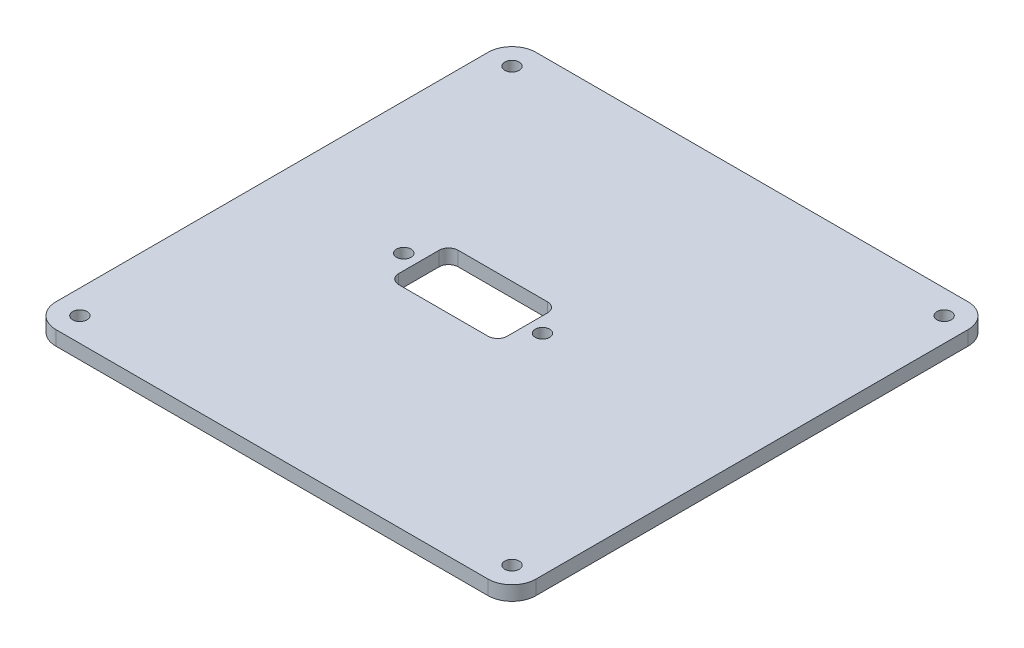
ISO-10303-21;
HEADER;
FILE_DESCRIPTION(('STEP AP214'),'2;1');
FILE_NAME('part.step','',(''),(''),'','','');
FILE_SCHEMA(('AUTOMOTIVE_DESIGN { 1 0 10303 214 1 1 1 1 }'));
ENDSEC;
DATA;
#1=APPLICATION_CONTEXT('core data for automotive mechanical design processes');
#2=APPLICATION_PROTOCOL_DEFINITION('international standard','automotive_design',2000,#1);
#3=PRODUCT_CONTEXT('',#1,'mechanical');
#4=PRODUCT('Part','Part','',(#3));
#5=PRODUCT_RELATED_PRODUCT_CATEGORY('part','',(#4));
#6=PRODUCT_DEFINITION_FORMATION('','',#4);
#7=PRODUCT_DEFINITION_CONTEXT('part definition',#1,'design');
#8=PRODUCT_DEFINITION('design','',#6,#7);
#9=PRODUCT_DEFINITION_SHAPE('','',#8);
#10=(LENGTH_UNIT() NAMED_UNIT(*) SI_UNIT(.MILLI.,.METRE.));
#11=(NAMED_UNIT(*) PLANE_ANGLE_UNIT() SI_UNIT($,.RADIAN.));
#12=(NAMED_UNIT(*) SI_UNIT($,.STERADIAN.) SOLID_ANGLE_UNIT());
#13=UNCERTAINTY_MEASURE_WITH_UNIT(LENGTH_MEASURE(1.E-05),#10,'distance_accuracy_value','');
#14=(GEOMETRIC_REPRESENTATION_CONTEXT(3) GLOBAL_UNCERTAINTY_ASSIGNED_CONTEXT((#13)) GLOBAL_UNIT_ASSIGNED_CONTEXT((#10,
#11,#12)) REPRESENTATION_CONTEXT('',''));
#15=CARTESIAN_POINT('',(0.,0.,0.));
#16=DIRECTION('',(0.,0.,1.));
#17=DIRECTION('',(1.,0.,0.));
#18=AXIS2_PLACEMENT_3D('',#15,#16,#17);
#19=CARTESIAN_POINT('',(45.,3.,45.));
#20=DIRECTION('',(0.,-1.,0.));
#21=DIRECTION('',(0.,0.,-1.));
#22=AXIS2_PLACEMENT_3D('',#19,#20,#21);
#23=PLANE('',#22);
#24=CARTESIAN_POINT('',(-22.545,3.,0.));
#25=DIRECTION('',(0.,1.,0.));
#26=DIRECTION('',(0.,0.,1.));
#27=AXIS2_PLACEMENT_3D('',#24,#25,#26);
#28=CIRCLE('',#27,1.5);
#29=CARTESIAN_POINT('',(-22.545,3.,1.5));
#30=VERTEX_POINT('',#29);
#31=EDGE_CURVE('E213',#30,#30,#28,.T.);
#32=ORIENTED_EDGE('',*,*,#31,.F.);
#33=EDGE_LOOP('',(#32));
#34=FACE_BOUND('',#33,.T.);
#35=CARTESIAN_POINT('',(6.345,3.,0.));
#36=DIRECTION('',(0.,1.,0.));
#37=DIRECTION('',(0.,0.,1.));
#38=AXIS2_PLACEMENT_3D('',#35,#36,#37);
#39=CIRCLE('',#38,1.5);
#40=CARTESIAN_POINT('',(6.345,3.,1.5));
#41=VERTEX_POINT('',#40);
#42=EDGE_CURVE('E219',#41,#41,#39,.T.);
#43=ORIENTED_EDGE('',*,*,#42,.F.);
#44=EDGE_LOOP('',(#43));
#45=FACE_BOUND('',#44,.T.);
#46=CARTESIAN_POINT('',(45.,3.,45.));
#47=DIRECTION('',(0.,1.,0.));
#48=DIRECTION('',(0.,0.,1.));
#49=AXIS2_PLACEMENT_3D('',#46,#47,#48);
#50=CIRCLE('',#49,1.5);
#51=CARTESIAN_POINT('',(45.,3.,46.5));
#52=VERTEX_POINT('',#51);
#53=EDGE_CURVE('E225',#52,#52,#50,.T.);
#54=ORIENTED_EDGE('',*,*,#53,.F.);
#55=EDGE_LOOP('',(#54));
#56=FACE_BOUND('',#55,.T.);
#57=CARTESIAN_POINT('',(-45.,3.,45.));
#58=DIRECTION('',(0.,1.,0.));
#59=DIRECTION('',(0.,0.,1.));
#60=AXIS2_PLACEMENT_3D('',#57,#58,#59);
#61=CIRCLE('',#60,1.5);
#62=CARTESIAN_POINT('',(-45.,3.,46.5));
#63=VERTEX_POINT('',#62);
#64=EDGE_CURVE('E231',#63,#63,#61,.T.);
#65=ORIENTED_EDGE('',*,*,#64,.F.);
#66=EDGE_LOOP('',(#65));
#67=FACE_BOUND('',#66,.T.);
#68=CARTESIAN_POINT('',(45.,3.,-45.));
#69=DIRECTION('',(0.,1.,0.));
#70=DIRECTION('',(0.,0.,1.));
#71=AXIS2_PLACEMENT_3D('',#68,#69,#70);
#72=CIRCLE('',#71,1.5);
#73=CARTESIAN_POINT('',(45.,3.,-43.5));
#74=VERTEX_POINT('',#73);
#75=EDGE_CURVE('E237',#74,#74,#72,.T.);
#76=ORIENTED_EDGE('',*,*,#75,.F.);
#77=EDGE_LOOP('',(#76));
#78=FACE_BOUND('',#77,.T.);
#79=CARTESIAN_POINT('',(-45.,3.,-45.));
#80=DIRECTION('',(0.,1.,0.));
#81=DIRECTION('',(0.,0.,1.));
#82=AXIS2_PLACEMENT_3D('',#79,#80,#81);
#83=CIRCLE('',#82,1.5);
#84=CARTESIAN_POINT('',(-45.,3.,-43.5));
#85=VERTEX_POINT('',#84);
#86=EDGE_CURVE('E243',#85,#85,#83,.T.);
#87=ORIENTED_EDGE('',*,*,#86,.F.);
#88=EDGE_LOOP('',(#87));
#89=FACE_BOUND('',#88,.T.);
#90=CARTESIAN_POINT('',(45.,3.,45.));
#91=DIRECTION('',(0.,1.,0.));
#92=DIRECTION('',(0.,0.,-1.));
#93=AXIS2_PLACEMENT_3D('',#90,#91,#92);
#94=CIRCLE('',#93,4.99999999999999);
#95=CARTESIAN_POINT('',(45.,3.,50.));
#96=VERTEX_POINT('',#95);
#97=CARTESIAN_POINT('',(50.,3.,45.));
#98=VERTEX_POINT('',#97);
#99=EDGE_CURVE('E249',#96,#98,#94,.T.);
#100=ORIENTED_EDGE('',*,*,#99,.T.);
#101=DIRECTION('',(0.,0.,-1.));
#102=VECTOR('',#101,1.);
#103=CARTESIAN_POINT('',(50.,3.,-45.));
#104=LINE('',#103,#102);
#105=CARTESIAN_POINT('',(50.,3.,-45.));
#106=VERTEX_POINT('',#105);
#107=EDGE_CURVE('E252',#98,#106,#104,.T.);
#108=ORIENTED_EDGE('',*,*,#107,.T.);
#109=CARTESIAN_POINT('',(45.,3.,-45.));
#110=DIRECTION('',(0.,1.,0.));
#111=DIRECTION('',(0.,0.,-1.));
#112=AXIS2_PLACEMENT_3D('',#109,#110,#111);
#113=CIRCLE('',#112,5.);
#114=CARTESIAN_POINT('',(45.,3.,-50.));
#115=VERTEX_POINT('',#114);
#116=EDGE_CURVE('E255',#106,#115,#113,.T.);
#117=ORIENTED_EDGE('',*,*,#116,.T.);
#118=DIRECTION('',(-1.,0.,0.));
#119=VECTOR('',#118,1.);
#120=CARTESIAN_POINT('',(-45.,3.,-50.));
#121=LINE('',#120,#119);
#122=CARTESIAN_POINT('',(-45.,3.,-50.));
#123=VERTEX_POINT('',#122);
#124=EDGE_CURVE('E257',#115,#123,#121,.T.);
#125=ORIENTED_EDGE('',*,*,#124,.T.);
#126=CARTESIAN_POINT('',(-45.,3.,-45.));
#127=DIRECTION('',(0.,1.,0.));
#128=DIRECTION('',(0.,0.,1.));
#129=AXIS2_PLACEMENT_3D('',#126,#127,#128);
#130=CIRCLE('',#129,5.);
#131=CARTESIAN_POINT('',(-50.,3.,-45.));
#132=VERTEX_POINT('',#131);
#133=EDGE_CURVE('E259',#123,#132,#130,.T.);
#134=ORIENTED_EDGE('',*,*,#133,.T.);
#135=DIRECTION('',(0.,0.,1.));
#136=VECTOR('',#135,1.);
#137=CARTESIAN_POINT('',(-50.,3.,-45.));
#138=LINE('',#137,#136);
#139=CARTESIAN_POINT('',(-50.,3.,45.));
#140=VERTEX_POINT('',#139);
#141=EDGE_CURVE('E261',#132,#140,#138,.T.);
#142=ORIENTED_EDGE('',*,*,#141,.T.);
#143=CARTESIAN_POINT('',(-45.,3.,45.));
#144=DIRECTION('',(0.,1.,0.));
#145=DIRECTION('',(0.,0.,-1.));
#146=AXIS2_PLACEMENT_3D('',#143,#144,#145);
#147=CIRCLE('',#146,5.);
#148=CARTESIAN_POINT('',(-45.,3.,50.));
#149=VERTEX_POINT('',#148);
#150=EDGE_CURVE('E263',#140,#149,#147,.T.);
#151=ORIENTED_EDGE('',*,*,#150,.T.);
#152=DIRECTION('',(1.,0.,0.));
#153=VECTOR('',#152,1.);
#154=CARTESIAN_POINT('',(-45.,3.,50.));
#155=LINE('',#154,#153);
#156=EDGE_CURVE('E265',#149,#96,#155,.T.);
#157=ORIENTED_EDGE('',*,*,#156,.T.);
#158=EDGE_LOOP('',(#100,#108,#117,#125,#134,#142,#151,#157));
#159=FACE_BOUND('',#158,.T.);
#160=CARTESIAN_POINT('',(1.2,3.,4.2));
#161=DIRECTION('',(0.,1.,0.));
#162=DIRECTION('',(0.,0.,-1.));
#163=AXIS2_PLACEMENT_3D('',#160,#161,#162);
#164=CIRCLE('',#163,2.);
#165=CARTESIAN_POINT('',(1.2,3.,6.2));
#166=VERTEX_POINT('',#165);
#167=CARTESIAN_POINT('',(3.2,3.,4.2));
#168=VERTEX_POINT('',#167);
#169=EDGE_CURVE('E148',#166,#168,#164,.T.);
#170=ORIENTED_EDGE('',*,*,#169,.F.);
#171=DIRECTION('',(1.,0.,0.));
#172=VECTOR('',#171,1.);
#173=CARTESIAN_POINT('',(-17.4,3.,6.2));
#174=LINE('',#173,#172);
#175=CARTESIAN_POINT('',(-17.4,3.,6.2));
#176=VERTEX_POINT('',#175);
#177=EDGE_CURVE('E181',#176,#166,#174,.T.);
#178=ORIENTED_EDGE('',*,*,#177,.F.);
#179=CARTESIAN_POINT('',(-17.4,3.,4.2));
#180=DIRECTION('',(0.,1.,0.));
#181=DIRECTION('',(0.,0.,-1.));
#182=AXIS2_PLACEMENT_3D('',#179,#180,#181);
#183=CIRCLE('',#182,2.);
#184=CARTESIAN_POINT('',(-19.4,3.,4.2));
#185=VERTEX_POINT('',#184);
#186=EDGE_CURVE('E179',#185,#176,#183,.T.);
#187=ORIENTED_EDGE('',*,*,#186,.F.);
#188=DIRECTION('',(0.,0.,1.));
#189=VECTOR('',#188,1.);
#190=CARTESIAN_POINT('',(-19.4,3.,-4.2));
#191=LINE('',#190,#189);
#192=CARTESIAN_POINT('',(-19.4,3.,-4.2));
#193=VERTEX_POINT('',#192);
#194=EDGE_CURVE('E177',#193,#185,#191,.T.);
#195=ORIENTED_EDGE('',*,*,#194,.F.);
#196=CARTESIAN_POINT('',(-17.4,3.,-4.2));
#197=DIRECTION('',(0.,1.,0.));
#198=DIRECTION('',(0.,0.,1.));
#199=AXIS2_PLACEMENT_3D('',#196,#197,#198);
#200=CIRCLE('',#199,2.);
#201=CARTESIAN_POINT('',(-17.4,3.,-6.2));
#202=VERTEX_POINT('',#201);
#203=EDGE_CURVE('E175',#202,#193,#200,.T.);
#204=ORIENTED_EDGE('',*,*,#203,.F.);
#205=DIRECTION('',(-1.,0.,0.));
#206=VECTOR('',#205,1.);
#207=CARTESIAN_POINT('',(-17.4,3.,-6.2));
#208=LINE('',#207,#206);
#209=CARTESIAN_POINT('',(1.2,3.,-6.2));
#210=VERTEX_POINT('',#209);
#211=EDGE_CURVE('E171',#210,#202,#208,.T.);
#212=ORIENTED_EDGE('',*,*,#211,.F.);
#213=CARTESIAN_POINT('',(1.2,3.,-4.2));
#214=DIRECTION('',(0.,1.,0.));
#215=DIRECTION('',(0.,0.,1.));
#216=AXIS2_PLACEMENT_3D('',#213,#214,#215);
#217=CIRCLE('',#216,2.);
#218=CARTESIAN_POINT('',(3.2,3.,-4.2));
#219=VERTEX_POINT('',#218);
#220=EDGE_CURVE('E169',#219,#210,#217,.T.);
#221=ORIENTED_EDGE('',*,*,#220,.F.);
#222=DIRECTION('',(0.,0.,-1.));
#223=VECTOR('',#222,1.);
#224=CARTESIAN_POINT('',(3.2,3.,-4.2));
#225=LINE('',#224,#223);
#226=EDGE_CURVE('E156',#168,#219,#225,.T.);
#227=ORIENTED_EDGE('',*,*,#226,.F.);
#228=EDGE_LOOP('',(#170,#178,#187,#195,#204,#212,#221,#227));
#229=FACE_BOUND('',#228,.T.);
#230=ADVANCED_FACE('F35',(#34,#45,#56,#67,#78,#89,#159,#229),#23,.F.);
#231=CARTESIAN_POINT('',(45.,0.,45.));
#232=DIRECTION('',(0.,-1.,0.));
#233=DIRECTION('',(0.,0.,-1.));
#234=AXIS2_PLACEMENT_3D('',#231,#232,#233);
#235=PLANE('',#234);
#236=CARTESIAN_POINT('',(6.345,0.,0.));
#237=DIRECTION('',(0.,1.,0.));
#238=DIRECTION('',(0.,0.,1.));
#239=AXIS2_PLACEMENT_3D('',#236,#237,#238);
#240=CIRCLE('',#239,1.5);
#241=CARTESIAN_POINT('',(6.345,0.,1.5));
#242=VERTEX_POINT('',#241);
#243=EDGE_CURVE('E216',#242,#242,#240,.T.);
#244=ORIENTED_EDGE('',*,*,#243,.T.);
#245=EDGE_LOOP('',(#244));
#246=FACE_BOUND('',#245,.T.);
#247=CARTESIAN_POINT('',(-45.,0.,45.));
#248=DIRECTION('',(0.,1.,0.));
#249=DIRECTION('',(0.,0.,1.));
#250=AXIS2_PLACEMENT_3D('',#247,#248,#249);
#251=CIRCLE('',#250,1.5);
#252=CARTESIAN_POINT('',(-45.,0.,46.5));
#253=VERTEX_POINT('',#252);
#254=EDGE_CURVE('E228',#253,#253,#251,.T.);
#255=ORIENTED_EDGE('',*,*,#254,.T.);
#256=EDGE_LOOP('',(#255));
#257=FACE_BOUND('',#256,.T.);
#258=CARTESIAN_POINT('',(-45.,0.,-45.));
#259=DIRECTION('',(0.,1.,0.));
#260=DIRECTION('',(0.,0.,1.));
#261=AXIS2_PLACEMENT_3D('',#258,#259,#260);
#262=CIRCLE('',#261,1.5);
#263=CARTESIAN_POINT('',(-45.,0.,-43.5));
#264=VERTEX_POINT('',#263);
#265=EDGE_CURVE('E240',#264,#264,#262,.T.);
#266=ORIENTED_EDGE('',*,*,#265,.T.);
#267=EDGE_LOOP('',(#266));
#268=FACE_BOUND('',#267,.T.);
#269=CARTESIAN_POINT('',(45.,0.,45.));
#270=DIRECTION('',(0.,1.,0.));
#271=DIRECTION('',(0.,0.,-1.));
#272=AXIS2_PLACEMENT_3D('',#269,#270,#271);
#273=CIRCLE('',#272,4.99999999999999);
#274=CARTESIAN_POINT('',(45.,0.,50.));
#275=VERTEX_POINT('',#274);
#276=CARTESIAN_POINT('',(50.,0.,45.));
#277=VERTEX_POINT('',#276);
#278=EDGE_CURVE('E246',#275,#277,#273,.T.);
#279=ORIENTED_EDGE('',*,*,#278,.F.);
#280=DIRECTION('',(1.,0.,0.));
#281=VECTOR('',#280,1.);
#282=CARTESIAN_POINT('',(-45.,0.,50.));
#283=LINE('',#282,#281);
#284=CARTESIAN_POINT('',(-45.,0.,50.));
#285=VERTEX_POINT('',#284);
#286=EDGE_CURVE('E253',#285,#275,#283,.T.);
#287=ORIENTED_EDGE('',*,*,#286,.F.);
#288=CARTESIAN_POINT('',(-45.,0.,45.));
#289=DIRECTION('',(0.,1.,0.));
#290=DIRECTION('',(0.,0.,-1.));
#291=AXIS2_PLACEMENT_3D('',#288,#289,#290);
#292=CIRCLE('',#291,5.);
#293=CARTESIAN_POINT('',(-50.,0.,45.));
#294=VERTEX_POINT('',#293);
#295=EDGE_CURVE('E280',#294,#285,#292,.T.);
#296=ORIENTED_EDGE('',*,*,#295,.F.);
#297=DIRECTION('',(0.,0.,1.));
#298=VECTOR('',#297,1.);
#299=CARTESIAN_POINT('',(-50.,0.,-45.));
#300=LINE('',#299,#298);
#301=CARTESIAN_POINT('',(-50.,0.,-45.));
#302=VERTEX_POINT('',#301);
#303=EDGE_CURVE('E278',#302,#294,#300,.T.);
#304=ORIENTED_EDGE('',*,*,#303,.F.);
#305=CARTESIAN_POINT('',(-45.,0.,-45.));
#306=DIRECTION('',(0.,1.,0.));
#307=DIRECTION('',(0.,0.,1.));
#308=AXIS2_PLACEMENT_3D('',#305,#306,#307);
#309=CIRCLE('',#308,5.);
#310=CARTESIAN_POINT('',(-45.,0.,-50.));
#311=VERTEX_POINT('',#310);
#312=EDGE_CURVE('E276',#311,#302,#309,.T.);
#313=ORIENTED_EDGE('',*,*,#312,.F.);
#314=DIRECTION('',(-1.,0.,0.));
#315=VECTOR('',#314,1.);
#316=CARTESIAN_POINT('',(-45.,0.,-50.));
#317=LINE('',#316,#315);
#318=CARTESIAN_POINT('',(45.,0.,-50.));
#319=VERTEX_POINT('',#318);
#320=EDGE_CURVE('E274',#319,#311,#317,.T.);
#321=ORIENTED_EDGE('',*,*,#320,.F.);
#322=CARTESIAN_POINT('',(45.,0.,-45.));
#323=DIRECTION('',(0.,1.,0.));
#324=DIRECTION('',(0.,0.,-1.));
#325=AXIS2_PLACEMENT_3D('',#322,#323,#324);
#326=CIRCLE('',#325,5.);
#327=CARTESIAN_POINT('',(50.,0.,-45.));
#328=VERTEX_POINT('',#327);
#329=EDGE_CURVE('E272',#328,#319,#326,.T.);
#330=ORIENTED_EDGE('',*,*,#329,.F.);
#331=DIRECTION('',(0.,0.,-1.));
#332=VECTOR('',#331,1.);
#333=CARTESIAN_POINT('',(50.,0.,-45.));
#334=LINE('',#333,#332);
#335=EDGE_CURVE('E270',#277,#328,#334,.T.);
#336=ORIENTED_EDGE('',*,*,#335,.F.);
#337=EDGE_LOOP('',(#279,#287,#296,#304,#313,#321,#330,#336));
#338=FACE_BOUND('',#337,.T.);
#339=CARTESIAN_POINT('',(45.,0.,-45.));
#340=DIRECTION('',(0.,1.,0.));
#341=DIRECTION('',(0.,0.,1.));
#342=AXIS2_PLACEMENT_3D('',#339,#340,#341);
#343=CIRCLE('',#342,1.5);
#344=CARTESIAN_POINT('',(45.,0.,-43.5));
#345=VERTEX_POINT('',#344);
#346=EDGE_CURVE('E234',#345,#345,#343,.T.);
#347=ORIENTED_EDGE('',*,*,#346,.T.);
#348=EDGE_LOOP('',(#347));
#349=FACE_BOUND('',#348,.T.);
#350=CARTESIAN_POINT('',(45.,0.,45.));
#351=DIRECTION('',(0.,1.,0.));
#352=DIRECTION('',(0.,0.,1.));
#353=AXIS2_PLACEMENT_3D('',#350,#351,#352);
#354=CIRCLE('',#353,1.5);
#355=CARTESIAN_POINT('',(45.,0.,46.5));
#356=VERTEX_POINT('',#355);
#357=EDGE_CURVE('E222',#356,#356,#354,.T.);
#358=ORIENTED_EDGE('',*,*,#357,.T.);
#359=EDGE_LOOP('',(#358));
#360=FACE_BOUND('',#359,.T.);
#361=CARTESIAN_POINT('',(-22.545,0.,0.));
#362=DIRECTION('',(0.,1.,0.));
#363=DIRECTION('',(0.,0.,1.));
#364=AXIS2_PLACEMENT_3D('',#361,#362,#363);
#365=CIRCLE('',#364,1.5);
#366=CARTESIAN_POINT('',(-22.545,0.,1.5));
#367=VERTEX_POINT('',#366);
#368=EDGE_CURVE('E164',#367,#367,#365,.T.);
#369=ORIENTED_EDGE('',*,*,#368,.T.);
#370=EDGE_LOOP('',(#369));
#371=FACE_BOUND('',#370,.T.);
#372=DIRECTION('',(1.,0.,0.));
#373=VECTOR('',#372,1.);
#374=CARTESIAN_POINT('',(-17.4,0.,6.2));
#375=LINE('',#374,#373);
#376=CARTESIAN_POINT('',(-17.4,0.,6.2));
#377=VERTEX_POINT('',#376);
#378=CARTESIAN_POINT('',(1.2,0.,6.2));
#379=VERTEX_POINT('',#378);
#380=EDGE_CURVE('E157',#377,#379,#375,.T.);
#381=ORIENTED_EDGE('',*,*,#380,.T.);
#382=CARTESIAN_POINT('',(1.2,0.,4.2));
#383=DIRECTION('',(0.,1.,0.));
#384=DIRECTION('',(0.,0.,-1.));
#385=AXIS2_PLACEMENT_3D('',#382,#383,#384);
#386=CIRCLE('',#385,2.);
#387=CARTESIAN_POINT('',(3.2,0.,4.2));
#388=VERTEX_POINT('',#387);
#389=EDGE_CURVE('E58',#379,#388,#386,.T.);
#390=ORIENTED_EDGE('',*,*,#389,.T.);
#391=DIRECTION('',(0.,0.,-1.));
#392=VECTOR('',#391,1.);
#393=CARTESIAN_POINT('',(3.2,0.,-4.2));
#394=LINE('',#393,#392);
#395=CARTESIAN_POINT('',(3.2,0.,-4.2));
#396=VERTEX_POINT('',#395);
#397=EDGE_CURVE('E163',#388,#396,#394,.T.);
#398=ORIENTED_EDGE('',*,*,#397,.T.);
#399=CARTESIAN_POINT('',(1.2,0.,-4.2));
#400=DIRECTION('',(0.,1.,0.));
#401=DIRECTION('',(0.,0.,1.));
#402=AXIS2_PLACEMENT_3D('',#399,#400,#401);
#403=CIRCLE('',#402,2.);
#404=CARTESIAN_POINT('',(1.2,0.,-6.2));
#405=VERTEX_POINT('',#404);
#406=EDGE_CURVE('E185',#396,#405,#403,.T.);
#407=ORIENTED_EDGE('',*,*,#406,.T.);
#408=DIRECTION('',(-1.,0.,0.));
#409=VECTOR('',#408,1.);
#410=CARTESIAN_POINT('',(-17.4,0.,-6.2));
#411=LINE('',#410,#409);
#412=CARTESIAN_POINT('',(-17.4,0.,-6.2));
#413=VERTEX_POINT('',#412);
#414=EDGE_CURVE('E188',#405,#413,#411,.T.);
#415=ORIENTED_EDGE('',*,*,#414,.T.);
#416=CARTESIAN_POINT('',(-17.4,0.,-4.2));
#417=DIRECTION('',(0.,1.,0.));
#418=DIRECTION('',(0.,0.,1.));
#419=AXIS2_PLACEMENT_3D('',#416,#417,#418);
#420=CIRCLE('',#419,2.);
#421=CARTESIAN_POINT('',(-19.4,0.,-4.2));
#422=VERTEX_POINT('',#421);
#423=EDGE_CURVE('E191',#413,#422,#420,.T.);
#424=ORIENTED_EDGE('',*,*,#423,.T.);
#425=DIRECTION('',(0.,0.,1.));
#426=VECTOR('',#425,1.);
#427=CARTESIAN_POINT('',(-19.4,0.,-4.2));
#428=LINE('',#427,#426);
#429=CARTESIAN_POINT('',(-19.4,0.,4.2));
#430=VERTEX_POINT('',#429);
#431=EDGE_CURVE('E194',#422,#430,#428,.T.);
#432=ORIENTED_EDGE('',*,*,#431,.T.);
#433=CARTESIAN_POINT('',(-17.4,0.,4.2));
#434=DIRECTION('',(0.,1.,0.));
#435=DIRECTION('',(0.,0.,-1.));
#436=AXIS2_PLACEMENT_3D('',#433,#434,#435);
#437=CIRCLE('',#436,2.);
#438=EDGE_CURVE('E197',#430,#377,#437,.T.);
#439=ORIENTED_EDGE('',*,*,#438,.T.);
#440=EDGE_LOOP('',(#381,#390,#398,#407,#415,#424,#432,#439));
#441=FACE_BOUND('',#440,.T.);
#442=ADVANCED_FACE('F310',(#246,#257,#268,#338,#349,#360,#371,#441),#235,.T.);
#443=CARTESIAN_POINT('',(45.,3.,45.));
#444=DIRECTION('',(0.,-1.,0.));
#445=DIRECTION('',(0.,0.,-1.));
#446=AXIS2_PLACEMENT_3D('',#443,#444,#445);
#447=CYLINDRICAL_SURFACE('',#446,4.99999999999999);
#448=ORIENTED_EDGE('',*,*,#278,.T.);
#449=DIRECTION('',(0.,-1.,0.));
#450=VECTOR('',#449,1.);
#451=CARTESIAN_POINT('',(50.,3.,45.));
#452=LINE('',#451,#450);
#453=EDGE_CURVE('E11',#98,#277,#452,.T.);
#454=ORIENTED_EDGE('',*,*,#453,.F.);
#455=ORIENTED_EDGE('',*,*,#99,.F.);
#456=DIRECTION('',(0.,-1.,0.));
#457=VECTOR('',#456,1.);
#458=CARTESIAN_POINT('',(45.,3.,50.));
#459=LINE('',#458,#457);
#460=EDGE_CURVE('E267',#96,#275,#459,.T.);
#461=ORIENTED_EDGE('',*,*,#460,.T.);
#462=EDGE_LOOP('',(#448,#454,#455,#461));
#463=FACE_BOUND('',#462,.T.);
#464=ADVANCED_FACE('F37',(#463),#447,.T.);
#465=CARTESIAN_POINT('',(50.,3.,-45.));
#466=DIRECTION('',(-1.,0.,0.));
#467=DIRECTION('',(0.,0.,1.));
#468=AXIS2_PLACEMENT_3D('',#465,#466,#467);
#469=PLANE('',#468);
#470=ORIENTED_EDGE('',*,*,#335,.T.);
#471=DIRECTION('',(0.,-1.,0.));
#472=VECTOR('',#471,1.);
#473=CARTESIAN_POINT('',(50.,3.,-45.));
#474=LINE('',#473,#472);
#475=EDGE_CURVE('E43',#106,#328,#474,.T.);
#476=ORIENTED_EDGE('',*,*,#475,.F.);
#477=ORIENTED_EDGE('',*,*,#107,.F.);
#478=ORIENTED_EDGE('',*,*,#453,.T.);
#479=EDGE_LOOP('',(#470,#476,#477,#478));
#480=FACE_BOUND('',#479,.T.);
#481=ADVANCED_FACE('F327',(#480),#469,.F.);
#482=CARTESIAN_POINT('',(45.,3.,-45.));
#483=DIRECTION('',(0.,-1.,0.));
#484=DIRECTION('',(0.,0.,-1.));
#485=AXIS2_PLACEMENT_3D('',#482,#483,#484);
#486=CYLINDRICAL_SURFACE('',#485,5.);
#487=ORIENTED_EDGE('',*,*,#329,.T.);
#488=DIRECTION('',(0.,-1.,0.));
#489=VECTOR('',#488,1.);
#490=CARTESIAN_POINT('',(45.,3.,-50.));
#491=LINE('',#490,#489);
#492=EDGE_CURVE('E297',#115,#319,#491,.T.);
#493=ORIENTED_EDGE('',*,*,#492,.F.);
#494=ORIENTED_EDGE('',*,*,#116,.F.);
#495=ORIENTED_EDGE('',*,*,#475,.T.);
#496=EDGE_LOOP('',(#487,#493,#494,#495));
#497=FACE_BOUND('',#496,.T.);
#498=ADVANCED_FACE('F304',(#497),#486,.T.);
#499=CARTESIAN_POINT('',(-45.,3.,-50.));
#500=DIRECTION('',(0.,0.,1.));
#501=DIRECTION('',(1.,0.,0.));
#502=AXIS2_PLACEMENT_3D('',#499,#500,#501);
#503=PLANE('',#502);
#504=ORIENTED_EDGE('',*,*,#320,.T.);
#505=DIRECTION('',(0.,-1.,0.));
#506=VECTOR('',#505,1.);
#507=CARTESIAN_POINT('',(-45.,3.,-50.));
#508=LINE('',#507,#506);
#509=EDGE_CURVE('E294',#123,#311,#508,.T.);
#510=ORIENTED_EDGE('',*,*,#509,.F.);
#511=ORIENTED_EDGE('',*,*,#124,.F.);
#512=ORIENTED_EDGE('',*,*,#492,.T.);
#513=EDGE_LOOP('',(#504,#510,#511,#512));
#514=FACE_BOUND('',#513,.T.);
#515=ADVANCED_FACE('F316',(#514),#503,.F.);
#516=CARTESIAN_POINT('',(-45.,3.,-45.));
#517=DIRECTION('',(0.,-1.,0.));
#518=DIRECTION('',(0.,0.,-1.));
#519=AXIS2_PLACEMENT_3D('',#516,#517,#518);
#520=CYLINDRICAL_SURFACE('',#519,5.);
#521=ORIENTED_EDGE('',*,*,#312,.T.);
#522=DIRECTION('',(0.,-1.,0.));
#523=VECTOR('',#522,1.);
#524=CARTESIAN_POINT('',(-50.,3.,-45.));
#525=LINE('',#524,#523);
#526=EDGE_CURVE('E291',#132,#302,#525,.T.);
#527=ORIENTED_EDGE('',*,*,#526,.F.);
#528=ORIENTED_EDGE('',*,*,#133,.F.);
#529=ORIENTED_EDGE('',*,*,#509,.T.);
#530=EDGE_LOOP('',(#521,#527,#528,#529));
#531=FACE_BOUND('',#530,.T.);
#532=ADVANCED_FACE('F320',(#531),#520,.T.);
#533=CARTESIAN_POINT('',(-50.,3.,-45.));
#534=DIRECTION('',(1.,0.,0.));
#535=DIRECTION('',(0.,0.,-1.));
#536=AXIS2_PLACEMENT_3D('',#533,#534,#535);
#537=PLANE('',#536);
#538=ORIENTED_EDGE('',*,*,#303,.T.);
#539=DIRECTION('',(0.,-1.,0.));
#540=VECTOR('',#539,1.);
#541=CARTESIAN_POINT('',(-50.,3.,45.));
#542=LINE('',#541,#540);
#543=EDGE_CURVE('E288',#140,#294,#542,.T.);
#544=ORIENTED_EDGE('',*,*,#543,.F.);
#545=ORIENTED_EDGE('',*,*,#141,.F.);
#546=ORIENTED_EDGE('',*,*,#526,.T.);
#547=EDGE_LOOP('',(#538,#544,#545,#546));
#548=FACE_BOUND('',#547,.T.);
#549=ADVANCED_FACE('F340',(#548),#537,.F.);
#550=CARTESIAN_POINT('',(-45.,3.,45.));
#551=DIRECTION('',(0.,-1.,0.));
#552=DIRECTION('',(0.,0.,-1.));
#553=AXIS2_PLACEMENT_3D('',#550,#551,#552);
#554=CYLINDRICAL_SURFACE('',#553,5.);
#555=ORIENTED_EDGE('',*,*,#295,.T.);
#556=DIRECTION('',(0.,-1.,0.));
#557=VECTOR('',#556,1.);
#558=CARTESIAN_POINT('',(-45.,3.,50.));
#559=LINE('',#558,#557);
#560=EDGE_CURVE('E285',#149,#285,#559,.T.);
#561=ORIENTED_EDGE('',*,*,#560,.F.);
#562=ORIENTED_EDGE('',*,*,#150,.F.);
#563=ORIENTED_EDGE('',*,*,#543,.T.);
#564=EDGE_LOOP('',(#555,#561,#562,#563));
#565=FACE_BOUND('',#564,.T.);
#566=ADVANCED_FACE('F338',(#565),#554,.T.);
#567=CARTESIAN_POINT('',(-45.,3.,50.));
#568=DIRECTION('',(0.,0.,-1.));
#569=DIRECTION('',(-1.,0.,0.));
#570=AXIS2_PLACEMENT_3D('',#567,#568,#569);
#571=PLANE('',#570);
#572=ORIENTED_EDGE('',*,*,#286,.T.);
#573=ORIENTED_EDGE('',*,*,#460,.F.);
#574=ORIENTED_EDGE('',*,*,#156,.F.);
#575=ORIENTED_EDGE('',*,*,#560,.T.);
#576=EDGE_LOOP('',(#572,#573,#574,#575));
#577=FACE_BOUND('',#576,.T.);
#578=ADVANCED_FACE('F333',(#577),#571,.F.);
#579=CARTESIAN_POINT('',(-45.,3.,-45.));
#580=DIRECTION('',(0.,-1.,0.));
#581=DIRECTION('',(0.,0.,-1.));
#582=AXIS2_PLACEMENT_3D('',#579,#580,#581);
#583=CYLINDRICAL_SURFACE('',#582,1.5);
#584=ORIENTED_EDGE('',*,*,#86,.T.);
#585=EDGE_LOOP('',(#584));
#586=FACE_BOUND('',#585,.T.);
#587=ORIENTED_EDGE('',*,*,#265,.F.);
#588=EDGE_LOOP('',(#587));
#589=FACE_BOUND('',#588,.T.);
#590=ADVANCED_FACE('F360',(#586,#589),#583,.F.);
#591=CARTESIAN_POINT('',(45.,3.,-45.));
#592=DIRECTION('',(0.,-1.,0.));
#593=DIRECTION('',(0.,0.,-1.));
#594=AXIS2_PLACEMENT_3D('',#591,#592,#593);
#595=CYLINDRICAL_SURFACE('',#594,1.5);
#596=ORIENTED_EDGE('',*,*,#75,.T.);
#597=EDGE_LOOP('',(#596));
#598=FACE_BOUND('',#597,.T.);
#599=ORIENTED_EDGE('',*,*,#346,.F.);
#600=EDGE_LOOP('',(#599));
#601=FACE_BOUND('',#600,.T.);
#602=ADVANCED_FACE('F367',(#598,#601),#595,.F.);
#603=CARTESIAN_POINT('',(-45.,3.,45.));
#604=DIRECTION('',(0.,-1.,0.));
#605=DIRECTION('',(0.,0.,-1.));
#606=AXIS2_PLACEMENT_3D('',#603,#604,#605);
#607=CYLINDRICAL_SURFACE('',#606,1.5);
#608=ORIENTED_EDGE('',*,*,#64,.T.);
#609=EDGE_LOOP('',(#608));
#610=FACE_BOUND('',#609,.T.);
#611=ORIENTED_EDGE('',*,*,#254,.F.);
#612=EDGE_LOOP('',(#611));
#613=FACE_BOUND('',#612,.T.);
#614=ADVANCED_FACE('F372',(#610,#613),#607,.F.);
#615=CARTESIAN_POINT('',(45.,3.,45.));
#616=DIRECTION('',(0.,-1.,0.));
#617=DIRECTION('',(0.,0.,-1.));
#618=AXIS2_PLACEMENT_3D('',#615,#616,#617);
#619=CYLINDRICAL_SURFACE('',#618,1.5);
#620=ORIENTED_EDGE('',*,*,#53,.T.);
#621=EDGE_LOOP('',(#620));
#622=FACE_BOUND('',#621,.T.);
#623=ORIENTED_EDGE('',*,*,#357,.F.);
#624=EDGE_LOOP('',(#623));
#625=FACE_BOUND('',#624,.T.);
#626=ADVANCED_FACE('F382',(#622,#625),#619,.F.);
#627=CARTESIAN_POINT('',(6.345,3.,0.));
#628=DIRECTION('',(0.,-1.,0.));
#629=DIRECTION('',(0.,0.,-1.));
#630=AXIS2_PLACEMENT_3D('',#627,#628,#629);
#631=CYLINDRICAL_SURFACE('',#630,1.5);
#632=ORIENTED_EDGE('',*,*,#42,.T.);
#633=EDGE_LOOP('',(#632));
#634=FACE_BOUND('',#633,.T.);
#635=ORIENTED_EDGE('',*,*,#243,.F.);
#636=EDGE_LOOP('',(#635));
#637=FACE_BOUND('',#636,.T.);
#638=ADVANCED_FACE('F389',(#634,#637),#631,.F.);
#639=CARTESIAN_POINT('',(-22.545,3.,0.));
#640=DIRECTION('',(0.,-1.,0.));
#641=DIRECTION('',(0.,0.,-1.));
#642=AXIS2_PLACEMENT_3D('',#639,#640,#641);
#643=CYLINDRICAL_SURFACE('',#642,1.5);
#644=ORIENTED_EDGE('',*,*,#31,.T.);
#645=EDGE_LOOP('',(#644));
#646=FACE_BOUND('',#645,.T.);
#647=ORIENTED_EDGE('',*,*,#368,.F.);
#648=EDGE_LOOP('',(#647));
#649=FACE_BOUND('',#648,.T.);
#650=ADVANCED_FACE('F393',(#646,#649),#643,.F.);
#651=CARTESIAN_POINT('',(1.2,3.,4.2));
#652=DIRECTION('',(0.,-1.,0.));
#653=DIRECTION('',(0.,0.,-1.));
#654=AXIS2_PLACEMENT_3D('',#651,#652,#653);
#655=CYLINDRICAL_SURFACE('',#654,2.);
#656=ORIENTED_EDGE('',*,*,#389,.F.);
#657=DIRECTION('',(0.,-1.,0.));
#658=VECTOR('',#657,1.);
#659=CARTESIAN_POINT('',(1.2,3.,6.2));
#660=LINE('',#659,#658);
#661=EDGE_CURVE('E152',#166,#379,#660,.T.);
#662=ORIENTED_EDGE('',*,*,#661,.F.);
#663=ORIENTED_EDGE('',*,*,#169,.T.);
#664=DIRECTION('',(0.,-1.,0.));
#665=VECTOR('',#664,1.);
#666=CARTESIAN_POINT('',(3.2,3.,4.2));
#667=LINE('',#666,#665);
#668=EDGE_CURVE('E151',#168,#388,#667,.T.);
#669=ORIENTED_EDGE('',*,*,#668,.T.);
#670=EDGE_LOOP('',(#656,#662,#663,#669));
#671=FACE_BOUND('',#670,.T.);
#672=ADVANCED_FACE('F150',(#671),#655,.F.);
#673=CARTESIAN_POINT('',(3.2,3.,-4.2));
#674=DIRECTION('',(-1.,0.,0.));
#675=DIRECTION('',(0.,0.,1.));
#676=AXIS2_PLACEMENT_3D('',#673,#674,#675);
#677=PLANE('',#676);
#678=ORIENTED_EDGE('',*,*,#397,.F.);
#679=ORIENTED_EDGE('',*,*,#668,.F.);
#680=ORIENTED_EDGE('',*,*,#226,.T.);
#681=DIRECTION('',(0.,-1.,0.));
#682=VECTOR('',#681,1.);
#683=CARTESIAN_POINT('',(3.2,3.,-4.2));
#684=LINE('',#683,#682);
#685=EDGE_CURVE('E165',#219,#396,#684,.T.);
#686=ORIENTED_EDGE('',*,*,#685,.T.);
#687=EDGE_LOOP('',(#678,#679,#680,#686));
#688=FACE_BOUND('',#687,.T.);
#689=ADVANCED_FACE('F160',(#688),#677,.T.);
#690=CARTESIAN_POINT('',(1.2,3.,-4.2));
#691=DIRECTION('',(0.,-1.,0.));
#692=DIRECTION('',(0.,0.,-1.));
#693=AXIS2_PLACEMENT_3D('',#690,#691,#692);
#694=CYLINDRICAL_SURFACE('',#693,2.);
#695=ORIENTED_EDGE('',*,*,#406,.F.);
#696=ORIENTED_EDGE('',*,*,#685,.F.);
#697=ORIENTED_EDGE('',*,*,#220,.T.);
#698=DIRECTION('',(0.,-1.,0.));
#699=VECTOR('',#698,1.);
#700=CARTESIAN_POINT('',(1.2,3.,-6.2));
#701=LINE('',#700,#699);
#702=EDGE_CURVE('E210',#210,#405,#701,.T.);
#703=ORIENTED_EDGE('',*,*,#702,.T.);
#704=EDGE_LOOP('',(#695,#696,#697,#703));
#705=FACE_BOUND('',#704,.T.);
#706=ADVANCED_FACE('F402',(#705),#694,.F.);
#707=CARTESIAN_POINT('',(-17.4,3.,-6.2));
#708=DIRECTION('',(0.,0.,1.));
#709=DIRECTION('',(1.,0.,0.));
#710=AXIS2_PLACEMENT_3D('',#707,#708,#709);
#711=PLANE('',#710);
#712=ORIENTED_EDGE('',*,*,#414,.F.);
#713=ORIENTED_EDGE('',*,*,#702,.F.);
#714=ORIENTED_EDGE('',*,*,#211,.T.);
#715=DIRECTION('',(0.,-1.,0.));
#716=VECTOR('',#715,1.);
#717=CARTESIAN_POINT('',(-17.4,3.,-6.2));
#718=LINE('',#717,#716);
#719=EDGE_CURVE('E208',#202,#413,#718,.T.);
#720=ORIENTED_EDGE('',*,*,#719,.T.);
#721=EDGE_LOOP('',(#712,#713,#714,#720));
#722=FACE_BOUND('',#721,.T.);
#723=ADVANCED_FACE('F405',(#722),#711,.T.);
#724=CARTESIAN_POINT('',(-17.4,3.,-4.2));
#725=DIRECTION('',(0.,-1.,0.));
#726=DIRECTION('',(0.,0.,-1.));
#727=AXIS2_PLACEMENT_3D('',#724,#725,#726);
#728=CYLINDRICAL_SURFACE('',#727,2.);
#729=ORIENTED_EDGE('',*,*,#423,.F.);
#730=ORIENTED_EDGE('',*,*,#719,.F.);
#731=ORIENTED_EDGE('',*,*,#203,.T.);
#732=DIRECTION('',(0.,-1.,0.));
#733=VECTOR('',#732,1.);
#734=CARTESIAN_POINT('',(-19.4,3.,-4.2));
#735=LINE('',#734,#733);
#736=EDGE_CURVE('E206',#193,#422,#735,.T.);
#737=ORIENTED_EDGE('',*,*,#736,.T.);
#738=EDGE_LOOP('',(#729,#730,#731,#737));
#739=FACE_BOUND('',#738,.T.);
#740=ADVANCED_FACE('F409',(#739),#728,.F.);
#741=CARTESIAN_POINT('',(-19.4,3.,-4.2));
#742=DIRECTION('',(1.,0.,0.));
#743=DIRECTION('',(0.,0.,-1.));
#744=AXIS2_PLACEMENT_3D('',#741,#742,#743);
#745=PLANE('',#744);
#746=ORIENTED_EDGE('',*,*,#431,.F.);
#747=ORIENTED_EDGE('',*,*,#736,.F.);
#748=ORIENTED_EDGE('',*,*,#194,.T.);
#749=DIRECTION('',(0.,-1.,0.));
#750=VECTOR('',#749,1.);
#751=CARTESIAN_POINT('',(-19.4,3.,4.2));
#752=LINE('',#751,#750);
#753=EDGE_CURVE('E204',#185,#430,#752,.T.);
#754=ORIENTED_EDGE('',*,*,#753,.T.);
#755=EDGE_LOOP('',(#746,#747,#748,#754));
#756=FACE_BOUND('',#755,.T.);
#757=ADVANCED_FACE('F413',(#756),#745,.T.);
#758=CARTESIAN_POINT('',(-17.4,3.,4.2));
#759=DIRECTION('',(0.,-1.,0.));
#760=DIRECTION('',(0.,0.,-1.));
#761=AXIS2_PLACEMENT_3D('',#758,#759,#760);
#762=CYLINDRICAL_SURFACE('',#761,2.);
#763=ORIENTED_EDGE('',*,*,#438,.F.);
#764=ORIENTED_EDGE('',*,*,#753,.F.);
#765=ORIENTED_EDGE('',*,*,#186,.T.);
#766=DIRECTION('',(0.,-1.,0.));
#767=VECTOR('',#766,1.);
#768=CARTESIAN_POINT('',(-17.4,3.,6.2));
#769=LINE('',#768,#767);
#770=EDGE_CURVE('E50',#176,#377,#769,.T.);
#771=ORIENTED_EDGE('',*,*,#770,.T.);
#772=EDGE_LOOP('',(#763,#764,#765,#771));
#773=FACE_BOUND('',#772,.T.);
#774=ADVANCED_FACE('F417',(#773),#762,.F.);
#775=CARTESIAN_POINT('',(-17.4,3.,6.2));
#776=DIRECTION('',(0.,0.,-1.));
#777=DIRECTION('',(-1.,0.,0.));
#778=AXIS2_PLACEMENT_3D('',#775,#776,#777);
#779=PLANE('',#778);
#780=ORIENTED_EDGE('',*,*,#380,.F.);
#781=ORIENTED_EDGE('',*,*,#770,.F.);
#782=ORIENTED_EDGE('',*,*,#177,.T.);
#783=ORIENTED_EDGE('',*,*,#661,.T.);
#784=EDGE_LOOP('',(#780,#781,#782,#783));
#785=FACE_BOUND('',#784,.T.);
#786=ADVANCED_FACE('F421',(#785),#779,.T.);
#787=CLOSED_SHELL('',(#230,#442,#464,#481,#498,#515,#532,#549,#566,#578,#590,#602,#614,#626,
#638,#650,#672,#689,#706,#723,#740,#757,#774,#786));
#788=MANIFOLD_SOLID_BREP('B2',#787);
#789=ADVANCED_BREP_SHAPE_REPRESENTATION('',(#18,#788),#14);
#790=SHAPE_DEFINITION_REPRESENTATION(#9,#789);
ENDSEC;
END-ISO-10303-21;
